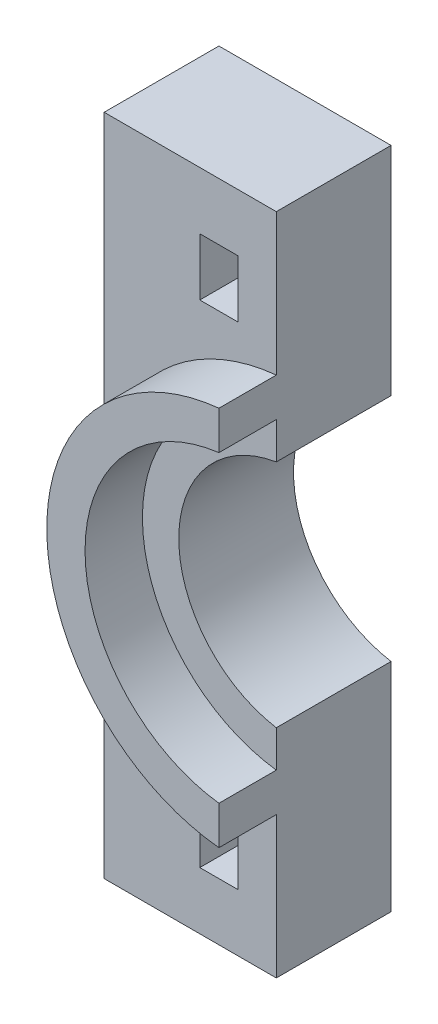
ISO-10303-21;
HEADER;
FILE_DESCRIPTION(('STEP AP214'),'2;1');
FILE_NAME('part.step','',(''),(''),'','','');
FILE_SCHEMA(('AUTOMOTIVE_DESIGN { 1 0 10303 214 1 1 1 1 }'));
ENDSEC;
DATA;
#1=APPLICATION_CONTEXT('core data for automotive mechanical design processes');
#2=APPLICATION_PROTOCOL_DEFINITION('international standard','automotive_design',2000,#1);
#3=PRODUCT_CONTEXT('',#1,'mechanical');
#4=PRODUCT('Part','Part','',(#3));
#5=PRODUCT_RELATED_PRODUCT_CATEGORY('part','',(#4));
#6=PRODUCT_DEFINITION_FORMATION('','',#4);
#7=PRODUCT_DEFINITION_CONTEXT('part definition',#1,'design');
#8=PRODUCT_DEFINITION('design','',#6,#7);
#9=PRODUCT_DEFINITION_SHAPE('','',#8);
#10=(LENGTH_UNIT() NAMED_UNIT(*) SI_UNIT(.MILLI.,.METRE.));
#11=(NAMED_UNIT(*) PLANE_ANGLE_UNIT() SI_UNIT($,.RADIAN.));
#12=(NAMED_UNIT(*) SI_UNIT($,.STERADIAN.) SOLID_ANGLE_UNIT());
#13=UNCERTAINTY_MEASURE_WITH_UNIT(LENGTH_MEASURE(1.E-05),#10,'distance_accuracy_value','');
#14=(GEOMETRIC_REPRESENTATION_CONTEXT(3) GLOBAL_UNCERTAINTY_ASSIGNED_CONTEXT((#13)) GLOBAL_UNIT_ASSIGNED_CONTEXT((#10,
#11,#12)) REPRESENTATION_CONTEXT('',''));
#15=CARTESIAN_POINT('',(0.,0.,0.));
#16=DIRECTION('',(0.,0.,1.));
#17=DIRECTION('',(1.,0.,0.));
#18=AXIS2_PLACEMENT_3D('',#15,#16,#17);
#19=CARTESIAN_POINT('',(0.,0.,6.));
#20=DIRECTION('',(0.,0.,1.));
#21=DIRECTION('',(1.,0.,0.));
#22=AXIS2_PLACEMENT_3D('',#19,#20,#21);
#23=PLANE('',#22);
#24=DIRECTION('',(0.,-1.,0.));
#25=VECTOR('',#24,1.);
#26=CARTESIAN_POINT('',(4.,0.,6.));
#27=LINE('',#26,#25);
#28=CARTESIAN_POINT('',(4.,7.93725393319378,6.));
#29=VERTEX_POINT('',#28);
#30=CARTESIAN_POINT('',(4.,6.01747455333216,6.));
#31=VERTEX_POINT('',#30);
#32=EDGE_CURVE('E277',#29,#31,#27,.T.);
#33=ORIENTED_EDGE('',*,*,#32,.F.);
#34=CARTESIAN_POINT('',(5.,0.,6.));
#35=DIRECTION('',(0.,0.,-1.));
#36=DIRECTION('',(1.,0.,0.));
#37=AXIS2_PLACEMENT_3D('',#34,#35,#36);
#38=CIRCLE('',#37,8.);
#39=CARTESIAN_POINT('',(4.,-7.93725393319377,6.));
#40=VERTEX_POINT('',#39);
#41=EDGE_CURVE('E38',#40,#29,#38,.T.);
#42=ORIENTED_EDGE('',*,*,#41,.F.);
#43=CARTESIAN_POINT('',(4.,-6.01747455333215,6.));
#44=VERTEX_POINT('',#43);
#45=EDGE_CURVE('E275',#44,#40,#27,.T.);
#46=ORIENTED_EDGE('',*,*,#45,.F.);
#47=CARTESIAN_POINT('',(5.,0.,6.));
#48=DIRECTION('',(0.,0.,1.));
#49=DIRECTION('',(1.,0.,0.));
#50=AXIS2_PLACEMENT_3D('',#47,#48,#49);
#51=CIRCLE('',#50,6.1);
#52=EDGE_CURVE('E223',#31,#44,#51,.T.);
#53=ORIENTED_EDGE('',*,*,#52,.F.);
#54=EDGE_LOOP('',(#33,#42,#46,#53));
#55=FACE_BOUND('',#54,.T.);
#56=ADVANCED_FACE('F34',(#55),#23,.T.);
#57=DIRECTION('',(0.,-1.,0.));
#58=VECTOR('',#57,1.);
#59=CARTESIAN_POINT('',(4.,0.,6.));
#60=LINE('',#59,#58);
#61=CARTESIAN_POINT('',(4.,17.35,6.));
#62=VERTEX_POINT('',#61);
#63=CARTESIAN_POINT('',(4.,9.9498743710662,6.));
#64=VERTEX_POINT('',#63);
#65=EDGE_CURVE('E278',#62,#64,#60,.T.);
#66=ORIENTED_EDGE('',*,*,#65,.F.);
#67=DIRECTION('',(1.,0.,0.));
#68=VECTOR('',#67,1.);
#69=CARTESIAN_POINT('',(0.,17.35,6.));
#70=LINE('',#69,#68);
#71=CARTESIAN_POINT('',(-5.,17.35,6.));
#72=VERTEX_POINT('',#71);
#73=EDGE_CURVE('E181',#72,#62,#70,.T.);
#74=ORIENTED_EDGE('',*,*,#73,.F.);
#75=DIRECTION('',(0.,-1.,0.));
#76=VECTOR('',#75,1.);
#77=CARTESIAN_POINT('',(-5.,0.,6.));
#78=LINE('',#77,#76);
#79=CARTESIAN_POINT('',(-5.,0.,6.));
#80=VERTEX_POINT('',#79);
#81=EDGE_CURVE('E306',#72,#80,#78,.T.);
#82=ORIENTED_EDGE('',*,*,#81,.T.);
#83=CARTESIAN_POINT('',(5.,0.,6.));
#84=DIRECTION('',(0.,0.,1.));
#85=DIRECTION('',(-1.,0.,0.));
#86=AXIS2_PLACEMENT_3D('',#83,#84,#85);
#87=CIRCLE('',#86,10.);
#88=EDGE_CURVE('E257',#64,#80,#87,.T.);
#89=ORIENTED_EDGE('',*,*,#88,.F.);
#90=EDGE_LOOP('',(#66,#74,#82,#89));
#91=FACE_BOUND('',#90,.T.);
#92=DIRECTION('',(1.,0.,0.));
#93=VECTOR('',#92,1.);
#94=CARTESIAN_POINT('',(0.,14.35,6.));
#95=LINE('',#94,#93);
#96=CARTESIAN_POINT('',(0.,14.35,6.));
#97=VERTEX_POINT('',#96);
#98=CARTESIAN_POINT('',(2.,14.35,6.));
#99=VERTEX_POINT('',#98);
#100=EDGE_CURVE('E321',#97,#99,#95,.T.);
#101=ORIENTED_EDGE('',*,*,#100,.T.);
#102=DIRECTION('',(0.,-1.,0.));
#103=VECTOR('',#102,1.);
#104=CARTESIAN_POINT('',(2.,0.,6.));
#105=LINE('',#104,#103);
#106=CARTESIAN_POINT('',(2.,11.35,6.));
#107=VERTEX_POINT('',#106);
#108=EDGE_CURVE('E324',#99,#107,#105,.T.);
#109=ORIENTED_EDGE('',*,*,#108,.T.);
#110=DIRECTION('',(1.,0.,0.));
#111=VECTOR('',#110,1.);
#112=CARTESIAN_POINT('',(0.,11.35,6.));
#113=LINE('',#112,#111);
#114=CARTESIAN_POINT('',(0.,11.35,6.));
#115=VERTEX_POINT('',#114);
#116=EDGE_CURVE('E326',#115,#107,#113,.T.);
#117=ORIENTED_EDGE('',*,*,#116,.F.);
#118=DIRECTION('',(0.,-1.,0.));
#119=VECTOR('',#118,1.);
#120=CARTESIAN_POINT('',(0.,0.,6.));
#121=LINE('',#120,#119);
#122=EDGE_CURVE('E247',#97,#115,#121,.T.);
#123=ORIENTED_EDGE('',*,*,#122,.F.);
#124=EDGE_LOOP('',(#101,#109,#117,#123));
#125=FACE_BOUND('',#124,.T.);
#126=ADVANCED_FACE('F337',(#91,#125),#23,.T.);
#127=CARTESIAN_POINT('',(0.,14.35,6.));
#128=DIRECTION('',(0.,1.,0.));
#129=DIRECTION('',(0.,0.,1.));
#130=AXIS2_PLACEMENT_3D('',#127,#128,#129);
#131=PLANE('',#130);
#132=DIRECTION('',(1.,0.,0.));
#133=VECTOR('',#132,1.);
#134=CARTESIAN_POINT('',(0.,14.35,0.));
#135=LINE('',#134,#133);
#136=CARTESIAN_POINT('',(0.,14.35,0.));
#137=VERTEX_POINT('',#136);
#138=CARTESIAN_POINT('',(2.,14.35,0.));
#139=VERTEX_POINT('',#138);
#140=EDGE_CURVE('E211',#137,#139,#135,.T.);
#141=ORIENTED_EDGE('',*,*,#140,.T.);
#142=DIRECTION('',(0.,0.,-1.));
#143=VECTOR('',#142,1.);
#144=CARTESIAN_POINT('',(2.,14.35,6.));
#145=LINE('',#144,#143);
#146=EDGE_CURVE('E231',#99,#139,#145,.T.);
#147=ORIENTED_EDGE('',*,*,#146,.F.);
#148=ORIENTED_EDGE('',*,*,#100,.F.);
#149=DIRECTION('',(0.,0.,-1.));
#150=VECTOR('',#149,1.);
#151=CARTESIAN_POINT('',(0.,14.35,6.));
#152=LINE('',#151,#150);
#153=EDGE_CURVE('E224',#97,#137,#152,.T.);
#154=ORIENTED_EDGE('',*,*,#153,.T.);
#155=EDGE_LOOP('',(#141,#147,#148,#154));
#156=FACE_BOUND('',#155,.T.);
#157=ADVANCED_FACE('F345',(#156),#131,.F.);
#158=CARTESIAN_POINT('',(2.,0.,6.));
#159=DIRECTION('',(1.,0.,0.));
#160=DIRECTION('',(0.,1.,0.));
#161=AXIS2_PLACEMENT_3D('',#158,#159,#160);
#162=PLANE('',#161);
#163=DIRECTION('',(0.,-1.,0.));
#164=VECTOR('',#163,1.);
#165=CARTESIAN_POINT('',(2.,0.,0.));
#166=LINE('',#165,#164);
#167=CARTESIAN_POINT('',(2.,11.35,0.));
#168=VERTEX_POINT('',#167);
#169=EDGE_CURVE('E214',#139,#168,#166,.T.);
#170=ORIENTED_EDGE('',*,*,#169,.T.);
#171=DIRECTION('',(0.,0.,-1.));
#172=VECTOR('',#171,1.);
#173=CARTESIAN_POINT('',(2.,11.35,6.));
#174=LINE('',#173,#172);
#175=EDGE_CURVE('E229',#107,#168,#174,.T.);
#176=ORIENTED_EDGE('',*,*,#175,.F.);
#177=ORIENTED_EDGE('',*,*,#108,.F.);
#178=ORIENTED_EDGE('',*,*,#146,.T.);
#179=EDGE_LOOP('',(#170,#176,#177,#178));
#180=FACE_BOUND('',#179,.T.);
#181=ADVANCED_FACE('F347',(#180),#162,.F.);
#182=CARTESIAN_POINT('',(0.,11.35,6.));
#183=DIRECTION('',(0.,1.,0.));
#184=DIRECTION('',(0.,0.,1.));
#185=AXIS2_PLACEMENT_3D('',#182,#183,#184);
#186=PLANE('',#185);
#187=DIRECTION('',(1.,0.,0.));
#188=VECTOR('',#187,1.);
#189=CARTESIAN_POINT('',(0.,11.35,0.));
#190=LINE('',#189,#188);
#191=CARTESIAN_POINT('',(0.,11.35,0.));
#192=VERTEX_POINT('',#191);
#193=EDGE_CURVE('E217',#192,#168,#190,.T.);
#194=ORIENTED_EDGE('',*,*,#193,.F.);
#195=DIRECTION('',(0.,0.,-1.));
#196=VECTOR('',#195,1.);
#197=CARTESIAN_POINT('',(0.,11.35,6.));
#198=LINE('',#197,#196);
#199=EDGE_CURVE('E226',#115,#192,#198,.T.);
#200=ORIENTED_EDGE('',*,*,#199,.F.);
#201=ORIENTED_EDGE('',*,*,#116,.T.);
#202=ORIENTED_EDGE('',*,*,#175,.T.);
#203=EDGE_LOOP('',(#194,#200,#201,#202));
#204=FACE_BOUND('',#203,.T.);
#205=ADVANCED_FACE('F341',(#204),#186,.T.);
#206=CARTESIAN_POINT('',(0.,-11.35,6.));
#207=DIRECTION('',(0.,1.,0.));
#208=DIRECTION('',(0.,0.,1.));
#209=AXIS2_PLACEMENT_3D('',#206,#207,#208);
#210=PLANE('',#209);
#211=DIRECTION('',(1.,0.,0.));
#212=VECTOR('',#211,1.);
#213=CARTESIAN_POINT('',(0.,-11.35,0.));
#214=LINE('',#213,#212);
#215=CARTESIAN_POINT('',(0.,-11.35,0.));
#216=VERTEX_POINT('',#215);
#217=CARTESIAN_POINT('',(2.,-11.35,0.));
#218=VERTEX_POINT('',#217);
#219=EDGE_CURVE('E199',#216,#218,#214,.T.);
#220=ORIENTED_EDGE('',*,*,#219,.T.);
#221=DIRECTION('',(0.,0.,-1.));
#222=VECTOR('',#221,1.);
#223=CARTESIAN_POINT('',(2.,-11.35,6.));
#224=LINE('',#223,#222);
#225=CARTESIAN_POINT('',(2.,-11.35,6.));
#226=VERTEX_POINT('',#225);
#227=EDGE_CURVE('E227',#226,#218,#224,.T.);
#228=ORIENTED_EDGE('',*,*,#227,.F.);
#229=DIRECTION('',(1.,0.,0.));
#230=VECTOR('',#229,1.);
#231=CARTESIAN_POINT('',(0.,-11.35,6.));
#232=LINE('',#231,#230);
#233=CARTESIAN_POINT('',(0.,-11.35,6.));
#234=VERTEX_POINT('',#233);
#235=EDGE_CURVE('E305',#234,#226,#232,.T.);
#236=ORIENTED_EDGE('',*,*,#235,.F.);
#237=DIRECTION('',(0.,0.,-1.));
#238=VECTOR('',#237,1.);
#239=CARTESIAN_POINT('',(0.,-11.35,6.));
#240=LINE('',#239,#238);
#241=EDGE_CURVE('E235',#234,#216,#240,.T.);
#242=ORIENTED_EDGE('',*,*,#241,.T.);
#243=EDGE_LOOP('',(#220,#228,#236,#242));
#244=FACE_BOUND('',#243,.T.);
#245=ADVANCED_FACE('F354',(#244),#210,.F.);
#246=CARTESIAN_POINT('',(2.,0.,6.));
#247=DIRECTION('',(1.,0.,0.));
#248=DIRECTION('',(0.,1.,0.));
#249=AXIS2_PLACEMENT_3D('',#246,#247,#248);
#250=PLANE('',#249);
#251=DIRECTION('',(0.,-1.,0.));
#252=VECTOR('',#251,1.);
#253=CARTESIAN_POINT('',(2.,0.,0.));
#254=LINE('',#253,#252);
#255=CARTESIAN_POINT('',(2.,-14.35,0.));
#256=VERTEX_POINT('',#255);
#257=EDGE_CURVE('E202',#218,#256,#254,.T.);
#258=ORIENTED_EDGE('',*,*,#257,.T.);
#259=DIRECTION('',(0.,0.,-1.));
#260=VECTOR('',#259,1.);
#261=CARTESIAN_POINT('',(2.,-14.35,6.));
#262=LINE('',#261,#260);
#263=CARTESIAN_POINT('',(2.,-14.35,6.));
#264=VERTEX_POINT('',#263);
#265=EDGE_CURVE('E240',#264,#256,#262,.T.);
#266=ORIENTED_EDGE('',*,*,#265,.F.);
#267=DIRECTION('',(0.,-1.,0.));
#268=VECTOR('',#267,1.);
#269=CARTESIAN_POINT('',(2.,0.,6.));
#270=LINE('',#269,#268);
#271=EDGE_CURVE('E309',#226,#264,#270,.T.);
#272=ORIENTED_EDGE('',*,*,#271,.F.);
#273=ORIENTED_EDGE('',*,*,#227,.T.);
#274=EDGE_LOOP('',(#258,#266,#272,#273));
#275=FACE_BOUND('',#274,.T.);
#276=ADVANCED_FACE('F387',(#275),#250,.F.);
#277=CARTESIAN_POINT('',(0.,-14.35,6.));
#278=DIRECTION('',(0.,1.,0.));
#279=DIRECTION('',(0.,0.,1.));
#280=AXIS2_PLACEMENT_3D('',#277,#278,#279);
#281=PLANE('',#280);
#282=DIRECTION('',(1.,0.,0.));
#283=VECTOR('',#282,1.);
#284=CARTESIAN_POINT('',(0.,-14.35,0.));
#285=LINE('',#284,#283);
#286=CARTESIAN_POINT('',(0.,-14.35,0.));
#287=VERTEX_POINT('',#286);
#288=EDGE_CURVE('E205',#287,#256,#285,.T.);
#289=ORIENTED_EDGE('',*,*,#288,.F.);
#290=DIRECTION('',(0.,0.,-1.));
#291=VECTOR('',#290,1.);
#292=CARTESIAN_POINT('',(0.,-14.35,6.));
#293=LINE('',#292,#291);
#294=CARTESIAN_POINT('',(0.,-14.35,6.));
#295=VERTEX_POINT('',#294);
#296=EDGE_CURVE('E237',#295,#287,#293,.T.);
#297=ORIENTED_EDGE('',*,*,#296,.F.);
#298=DIRECTION('',(1.,0.,0.));
#299=VECTOR('',#298,1.);
#300=CARTESIAN_POINT('',(0.,-14.35,6.));
#301=LINE('',#300,#299);
#302=EDGE_CURVE('E315',#295,#264,#301,.T.);
#303=ORIENTED_EDGE('',*,*,#302,.T.);
#304=ORIENTED_EDGE('',*,*,#265,.T.);
#305=EDGE_LOOP('',(#289,#297,#303,#304));
#306=FACE_BOUND('',#305,.T.);
#307=ADVANCED_FACE('F384',(#306),#281,.T.);
#308=CARTESIAN_POINT('',(5.,0.,6.));
#309=DIRECTION('',(0.,0.,-1.));
#310=DIRECTION('',(-1.,0.,0.));
#311=AXIS2_PLACEMENT_3D('',#308,#309,#310);
#312=CYLINDRICAL_SURFACE('',#311,6.1);
#313=DIRECTION('',(0.,0.,-1.));
#314=VECTOR('',#313,1.);
#315=CARTESIAN_POINT('',(4.,6.01747455333216,6.));
#316=LINE('',#315,#314);
#317=CARTESIAN_POINT('',(4.,6.01747455333216,0.));
#318=VERTEX_POINT('',#317);
#319=EDGE_CURVE('E168',#31,#318,#316,.T.);
#320=ORIENTED_EDGE('',*,*,#319,.F.);
#321=ORIENTED_EDGE('',*,*,#52,.T.);
#322=DIRECTION('',(0.,0.,-1.));
#323=VECTOR('',#322,1.);
#324=CARTESIAN_POINT('',(4.,-6.01747455333215,6.));
#325=LINE('',#324,#323);
#326=CARTESIAN_POINT('',(4.,-6.01747455333215,0.));
#327=VERTEX_POINT('',#326);
#328=EDGE_CURVE('E284',#327,#44,#325,.F.);
#329=ORIENTED_EDGE('',*,*,#328,.F.);
#330=CARTESIAN_POINT('',(5.,0.,0.));
#331=DIRECTION('',(0.,0.,1.));
#332=DIRECTION('',(1.,0.,0.));
#333=AXIS2_PLACEMENT_3D('',#330,#331,#332);
#334=CIRCLE('',#333,6.1);
#335=EDGE_CURVE('E189',#318,#327,#334,.T.);
#336=ORIENTED_EDGE('',*,*,#335,.F.);
#337=EDGE_LOOP('',(#320,#321,#329,#336));
#338=FACE_BOUND('',#337,.T.);
#339=ADVANCED_FACE('F36',(#338),#312,.F.);
#340=CARTESIAN_POINT('',(0.,17.35,6.));
#341=DIRECTION('',(0.,1.,0.));
#342=DIRECTION('',(0.,0.,1.));
#343=AXIS2_PLACEMENT_3D('',#340,#341,#342);
#344=PLANE('',#343);
#345=DIRECTION('',(0.,0.,1.));
#346=VECTOR('',#345,1.);
#347=CARTESIAN_POINT('',(4.,17.35,-3.));
#348=LINE('',#347,#346);
#349=CARTESIAN_POINT('',(4.,17.35,0.));
#350=VERTEX_POINT('',#349);
#351=EDGE_CURVE('E165',#350,#62,#348,.T.);
#352=ORIENTED_EDGE('',*,*,#351,.F.);
#353=DIRECTION('',(1.,0.,0.));
#354=VECTOR('',#353,1.);
#355=CARTESIAN_POINT('',(0.,17.35,0.));
#356=LINE('',#355,#354);
#357=CARTESIAN_POINT('',(-5.,17.35,0.));
#358=VERTEX_POINT('',#357);
#359=EDGE_CURVE('E179',#358,#350,#356,.T.);
#360=ORIENTED_EDGE('',*,*,#359,.F.);
#361=DIRECTION('',(0.,0.,-1.));
#362=VECTOR('',#361,1.);
#363=CARTESIAN_POINT('',(-5.,17.35,6.));
#364=LINE('',#363,#362);
#365=EDGE_CURVE('E238',#72,#358,#364,.T.);
#366=ORIENTED_EDGE('',*,*,#365,.F.);
#367=ORIENTED_EDGE('',*,*,#73,.T.);
#368=EDGE_LOOP('',(#352,#360,#366,#367));
#369=FACE_BOUND('',#368,.T.);
#370=ADVANCED_FACE('F178',(#369),#344,.T.);
#371=CARTESIAN_POINT('',(-5.,0.,6.));
#372=DIRECTION('',(1.,0.,0.));
#373=DIRECTION('',(0.,1.,0.));
#374=AXIS2_PLACEMENT_3D('',#371,#372,#373);
#375=PLANE('',#374);
#376=DIRECTION('',(0.,-1.,0.));
#377=VECTOR('',#376,1.);
#378=CARTESIAN_POINT('',(-5.,0.,0.));
#379=LINE('',#378,#377);
#380=CARTESIAN_POINT('',(-5.,-17.35,0.));
#381=VERTEX_POINT('',#380);
#382=EDGE_CURVE('E188',#358,#381,#379,.T.);
#383=ORIENTED_EDGE('',*,*,#382,.T.);
#384=DIRECTION('',(0.,0.,-1.));
#385=VECTOR('',#384,1.);
#386=CARTESIAN_POINT('',(-5.,-17.35,6.));
#387=LINE('',#386,#385);
#388=CARTESIAN_POINT('',(-5.,-17.35,6.));
#389=VERTEX_POINT('',#388);
#390=EDGE_CURVE('E244',#389,#381,#387,.T.);
#391=ORIENTED_EDGE('',*,*,#390,.F.);
#392=EDGE_CURVE('E303',#80,#389,#78,.T.);
#393=ORIENTED_EDGE('',*,*,#392,.F.);
#394=ORIENTED_EDGE('',*,*,#81,.F.);
#395=ORIENTED_EDGE('',*,*,#365,.T.);
#396=EDGE_LOOP('',(#383,#391,#393,#394,#395));
#397=FACE_BOUND('',#396,.T.);
#398=ADVANCED_FACE('F380',(#397),#375,.F.);
#399=CARTESIAN_POINT('',(0.,-17.35,6.));
#400=DIRECTION('',(0.,1.,0.));
#401=DIRECTION('',(0.,0.,1.));
#402=AXIS2_PLACEMENT_3D('',#399,#400,#401);
#403=PLANE('',#402);
#404=DIRECTION('',(1.,0.,0.));
#405=VECTOR('',#404,1.);
#406=CARTESIAN_POINT('',(0.,-17.35,0.));
#407=LINE('',#406,#405);
#408=CARTESIAN_POINT('',(4.,-17.35,0.));
#409=VERTEX_POINT('',#408);
#410=EDGE_CURVE('E191',#381,#409,#407,.T.);
#411=ORIENTED_EDGE('',*,*,#410,.T.);
#412=DIRECTION('',(0.,0.,1.));
#413=VECTOR('',#412,1.);
#414=CARTESIAN_POINT('',(4.,-17.35,-3.));
#415=LINE('',#414,#413);
#416=CARTESIAN_POINT('',(4.,-17.35,6.));
#417=VERTEX_POINT('',#416);
#418=EDGE_CURVE('E182',#409,#417,#415,.T.);
#419=ORIENTED_EDGE('',*,*,#418,.T.);
#420=DIRECTION('',(1.,0.,0.));
#421=VECTOR('',#420,1.);
#422=CARTESIAN_POINT('',(0.,-17.35,6.));
#423=LINE('',#422,#421);
#424=EDGE_CURVE('E297',#389,#417,#423,.T.);
#425=ORIENTED_EDGE('',*,*,#424,.F.);
#426=ORIENTED_EDGE('',*,*,#390,.T.);
#427=EDGE_LOOP('',(#411,#419,#425,#426));
#428=FACE_BOUND('',#427,.T.);
#429=ADVANCED_FACE('F296',(#428),#403,.F.);
#430=CARTESIAN_POINT('',(0.,0.,6.));
#431=DIRECTION('',(1.,0.,0.));
#432=DIRECTION('',(0.,1.,0.));
#433=AXIS2_PLACEMENT_3D('',#430,#431,#432);
#434=PLANE('',#433);
#435=DIRECTION('',(0.,-1.,0.));
#436=VECTOR('',#435,1.);
#437=CARTESIAN_POINT('',(0.,0.,0.));
#438=LINE('',#437,#436);
#439=EDGE_CURVE('E208',#216,#287,#438,.T.);
#440=ORIENTED_EDGE('',*,*,#439,.F.);
#441=ORIENTED_EDGE('',*,*,#241,.F.);
#442=DIRECTION('',(0.,-1.,0.));
#443=VECTOR('',#442,1.);
#444=CARTESIAN_POINT('',(0.,0.,6.));
#445=LINE('',#444,#443);
#446=EDGE_CURVE('E318',#234,#295,#445,.T.);
#447=ORIENTED_EDGE('',*,*,#446,.T.);
#448=ORIENTED_EDGE('',*,*,#296,.T.);
#449=EDGE_LOOP('',(#440,#441,#447,#448));
#450=FACE_BOUND('',#449,.T.);
#451=ADVANCED_FACE('F370',(#450),#434,.T.);
#452=CARTESIAN_POINT('',(0.,0.,6.));
#453=DIRECTION('',(1.,0.,0.));
#454=DIRECTION('',(0.,1.,0.));
#455=AXIS2_PLACEMENT_3D('',#452,#453,#454);
#456=PLANE('',#455);
#457=DIRECTION('',(0.,-1.,0.));
#458=VECTOR('',#457,1.);
#459=CARTESIAN_POINT('',(0.,0.,0.));
#460=LINE('',#459,#458);
#461=EDGE_CURVE('E220',#137,#192,#460,.T.);
#462=ORIENTED_EDGE('',*,*,#461,.F.);
#463=ORIENTED_EDGE('',*,*,#153,.F.);
#464=ORIENTED_EDGE('',*,*,#122,.T.);
#465=ORIENTED_EDGE('',*,*,#199,.T.);
#466=EDGE_LOOP('',(#462,#463,#464,#465));
#467=FACE_BOUND('',#466,.T.);
#468=ADVANCED_FACE('F332',(#467),#456,.T.);
#469=DIRECTION('',(0.,-1.,0.));
#470=VECTOR('',#469,1.);
#471=CARTESIAN_POINT('',(4.,0.,6.));
#472=LINE('',#471,#470);
#473=CARTESIAN_POINT('',(4.,-9.94987437106619,6.));
#474=VERTEX_POINT('',#473);
#475=EDGE_CURVE('E285',#474,#417,#472,.T.);
#476=ORIENTED_EDGE('',*,*,#475,.F.);
#477=EDGE_CURVE('E234',#80,#474,#87,.T.);
#478=ORIENTED_EDGE('',*,*,#477,.F.);
#479=ORIENTED_EDGE('',*,*,#392,.T.);
#480=ORIENTED_EDGE('',*,*,#424,.T.);
#481=EDGE_LOOP('',(#476,#478,#479,#480));
#482=FACE_BOUND('',#481,.T.);
#483=ORIENTED_EDGE('',*,*,#235,.T.);
#484=ORIENTED_EDGE('',*,*,#271,.T.);
#485=ORIENTED_EDGE('',*,*,#302,.F.);
#486=ORIENTED_EDGE('',*,*,#446,.F.);
#487=EDGE_LOOP('',(#483,#484,#485,#486));
#488=FACE_BOUND('',#487,.T.);
#489=ADVANCED_FACE('F300',(#482,#488),#23,.T.);
#490=CARTESIAN_POINT('',(0.,0.,0.));
#491=DIRECTION('',(0.,0.,1.));
#492=DIRECTION('',(1.,0.,0.));
#493=AXIS2_PLACEMENT_3D('',#490,#491,#492);
#494=PLANE('',#493);
#495=ORIENTED_EDGE('',*,*,#359,.T.);
#496=DIRECTION('',(0.,-1.,0.));
#497=VECTOR('',#496,1.);
#498=CARTESIAN_POINT('',(4.,0.,0.));
#499=LINE('',#498,#497);
#500=EDGE_CURVE('E162',#350,#318,#499,.T.);
#501=ORIENTED_EDGE('',*,*,#500,.T.);
#502=ORIENTED_EDGE('',*,*,#335,.T.);
#503=EDGE_CURVE('E174',#327,#409,#499,.T.);
#504=ORIENTED_EDGE('',*,*,#503,.T.);
#505=ORIENTED_EDGE('',*,*,#410,.F.);
#506=ORIENTED_EDGE('',*,*,#382,.F.);
#507=EDGE_LOOP('',(#495,#501,#502,#504,#505,#506));
#508=FACE_BOUND('',#507,.T.);
#509=ORIENTED_EDGE('',*,*,#219,.F.);
#510=ORIENTED_EDGE('',*,*,#439,.T.);
#511=ORIENTED_EDGE('',*,*,#288,.T.);
#512=ORIENTED_EDGE('',*,*,#257,.F.);
#513=EDGE_LOOP('',(#509,#510,#511,#512));
#514=FACE_BOUND('',#513,.T.);
#515=ORIENTED_EDGE('',*,*,#140,.F.);
#516=ORIENTED_EDGE('',*,*,#461,.T.);
#517=ORIENTED_EDGE('',*,*,#193,.T.);
#518=ORIENTED_EDGE('',*,*,#169,.F.);
#519=EDGE_LOOP('',(#515,#516,#517,#518));
#520=FACE_BOUND('',#519,.T.);
#521=ADVANCED_FACE('F185',(#508,#514,#520),#494,.F.);
#522=CARTESIAN_POINT('',(5.,0.,9.));
#523=DIRECTION('',(0.,0.,-1.));
#524=DIRECTION('',(-1.,0.,0.));
#525=AXIS2_PLACEMENT_3D('',#522,#523,#524);
#526=CYLINDRICAL_SURFACE('',#525,8.);
#527=ORIENTED_EDGE('',*,*,#41,.T.);
#528=DIRECTION('',(0.,0.,-1.));
#529=VECTOR('',#528,1.);
#530=CARTESIAN_POINT('',(4.,7.93725393319378,9.));
#531=LINE('',#530,#529);
#532=CARTESIAN_POINT('',(4.,7.93725393319378,9.));
#533=VERTEX_POINT('',#532);
#534=EDGE_CURVE('E270',#29,#533,#531,.F.);
#535=ORIENTED_EDGE('',*,*,#534,.T.);
#536=CARTESIAN_POINT('',(5.,0.,9.));
#537=DIRECTION('',(0.,0.,-1.));
#538=DIRECTION('',(1.,0.,0.));
#539=AXIS2_PLACEMENT_3D('',#536,#537,#538);
#540=CIRCLE('',#539,8.);
#541=CARTESIAN_POINT('',(4.,-7.93725393319377,9.));
#542=VERTEX_POINT('',#541);
#543=EDGE_CURVE('E258',#542,#533,#540,.T.);
#544=ORIENTED_EDGE('',*,*,#543,.F.);
#545=DIRECTION('',(0.,0.,-1.));
#546=VECTOR('',#545,1.);
#547=CARTESIAN_POINT('',(4.,-7.93725393319377,9.));
#548=LINE('',#547,#546);
#549=EDGE_CURVE('E59',#542,#40,#548,.T.);
#550=ORIENTED_EDGE('',*,*,#549,.T.);
#551=EDGE_LOOP('',(#527,#535,#544,#550));
#552=FACE_BOUND('',#551,.T.);
#553=ADVANCED_FACE('F268',(#552),#526,.F.);
#554=CARTESIAN_POINT('',(5.,0.,9.));
#555=DIRECTION('',(0.,0.,-1.));
#556=DIRECTION('',(-1.,0.,0.));
#557=AXIS2_PLACEMENT_3D('',#554,#555,#556);
#558=CYLINDRICAL_SURFACE('',#557,10.);
#559=CARTESIAN_POINT('',(5.,0.,9.));
#560=DIRECTION('',(0.,0.,1.));
#561=DIRECTION('',(-1.,0.,0.));
#562=AXIS2_PLACEMENT_3D('',#559,#560,#561);
#563=CIRCLE('',#562,10.);
#564=CARTESIAN_POINT('',(4.,9.9498743710662,9.));
#565=VERTEX_POINT('',#564);
#566=CARTESIAN_POINT('',(4.,-9.94987437106619,9.));
#567=VERTEX_POINT('',#566);
#568=EDGE_CURVE('E193',#565,#567,#563,.T.);
#569=ORIENTED_EDGE('',*,*,#568,.F.);
#570=DIRECTION('',(0.,0.,-1.));
#571=VECTOR('',#570,1.);
#572=CARTESIAN_POINT('',(4.,9.9498743710662,9.));
#573=LINE('',#572,#571);
#574=EDGE_CURVE('E51',#565,#64,#573,.T.);
#575=ORIENTED_EDGE('',*,*,#574,.T.);
#576=ORIENTED_EDGE('',*,*,#88,.T.);
#577=ORIENTED_EDGE('',*,*,#477,.T.);
#578=DIRECTION('',(0.,0.,-1.));
#579=VECTOR('',#578,1.);
#580=CARTESIAN_POINT('',(4.,-9.94987437106619,9.));
#581=LINE('',#580,#579);
#582=EDGE_CURVE('E288',#474,#567,#581,.F.);
#583=ORIENTED_EDGE('',*,*,#582,.T.);
#584=EDGE_LOOP('',(#569,#575,#576,#577,#583));
#585=FACE_BOUND('',#584,.T.);
#586=ADVANCED_FACE('F411',(#585),#558,.T.);
#587=CARTESIAN_POINT('',(5.,0.,9.));
#588=DIRECTION('',(0.,0.,1.));
#589=DIRECTION('',(1.,0.,0.));
#590=AXIS2_PLACEMENT_3D('',#587,#588,#589);
#591=PLANE('',#590);
#592=DIRECTION('',(0.,-1.,0.));
#593=VECTOR('',#592,1.);
#594=CARTESIAN_POINT('',(4.,0.,9.));
#595=LINE('',#594,#593);
#596=EDGE_CURVE('E11',#565,#533,#595,.T.);
#597=ORIENTED_EDGE('',*,*,#596,.F.);
#598=ORIENTED_EDGE('',*,*,#568,.T.);
#599=EDGE_CURVE('E44',#542,#567,#595,.T.);
#600=ORIENTED_EDGE('',*,*,#599,.F.);
#601=ORIENTED_EDGE('',*,*,#543,.T.);
#602=EDGE_LOOP('',(#597,#598,#600,#601));
#603=FACE_BOUND('',#602,.T.);
#604=ADVANCED_FACE('F410',(#603),#591,.T.);
#605=CARTESIAN_POINT('',(4.,17.35,-3.));
#606=DIRECTION('',(-1.,0.,0.));
#607=DIRECTION('',(0.,-1.,0.));
#608=AXIS2_PLACEMENT_3D('',#605,#606,#607);
#609=PLANE('',#608);
#610=ORIENTED_EDGE('',*,*,#328,.T.);
#611=ORIENTED_EDGE('',*,*,#45,.T.);
#612=ORIENTED_EDGE('',*,*,#549,.F.);
#613=ORIENTED_EDGE('',*,*,#599,.T.);
#614=ORIENTED_EDGE('',*,*,#582,.F.);
#615=ORIENTED_EDGE('',*,*,#475,.T.);
#616=ORIENTED_EDGE('',*,*,#418,.F.);
#617=ORIENTED_EDGE('',*,*,#503,.F.);
#618=EDGE_LOOP('',(#610,#611,#612,#613,#614,#615,#616,#617));
#619=FACE_BOUND('',#618,.T.);
#620=ADVANCED_FACE('F412',(#619),#609,.F.);
#621=ORIENTED_EDGE('',*,*,#351,.T.);
#622=ORIENTED_EDGE('',*,*,#65,.T.);
#623=ORIENTED_EDGE('',*,*,#574,.F.);
#624=ORIENTED_EDGE('',*,*,#596,.T.);
#625=ORIENTED_EDGE('',*,*,#534,.F.);
#626=ORIENTED_EDGE('',*,*,#32,.T.);
#627=ORIENTED_EDGE('',*,*,#319,.T.);
#628=ORIENTED_EDGE('',*,*,#500,.F.);
#629=EDGE_LOOP('',(#621,#622,#623,#624,#625,#626,#627,#628));
#630=FACE_BOUND('',#629,.T.);
#631=ADVANCED_FACE('F164',(#630),#609,.F.);
#632=CLOSED_SHELL('',(#56,#126,#157,#181,#205,#245,#276,#307,#339,#370,#398,#429,#451,#468,#489,
#521,#553,#586,#604,#620,#631));
#633=MANIFOLD_SOLID_BREP('B2',#632);
#634=ADVANCED_BREP_SHAPE_REPRESENTATION('',(#18,#633),#14);
#635=SHAPE_DEFINITION_REPRESENTATION(#9,#634);
ENDSEC;
END-ISO-10303-21;
